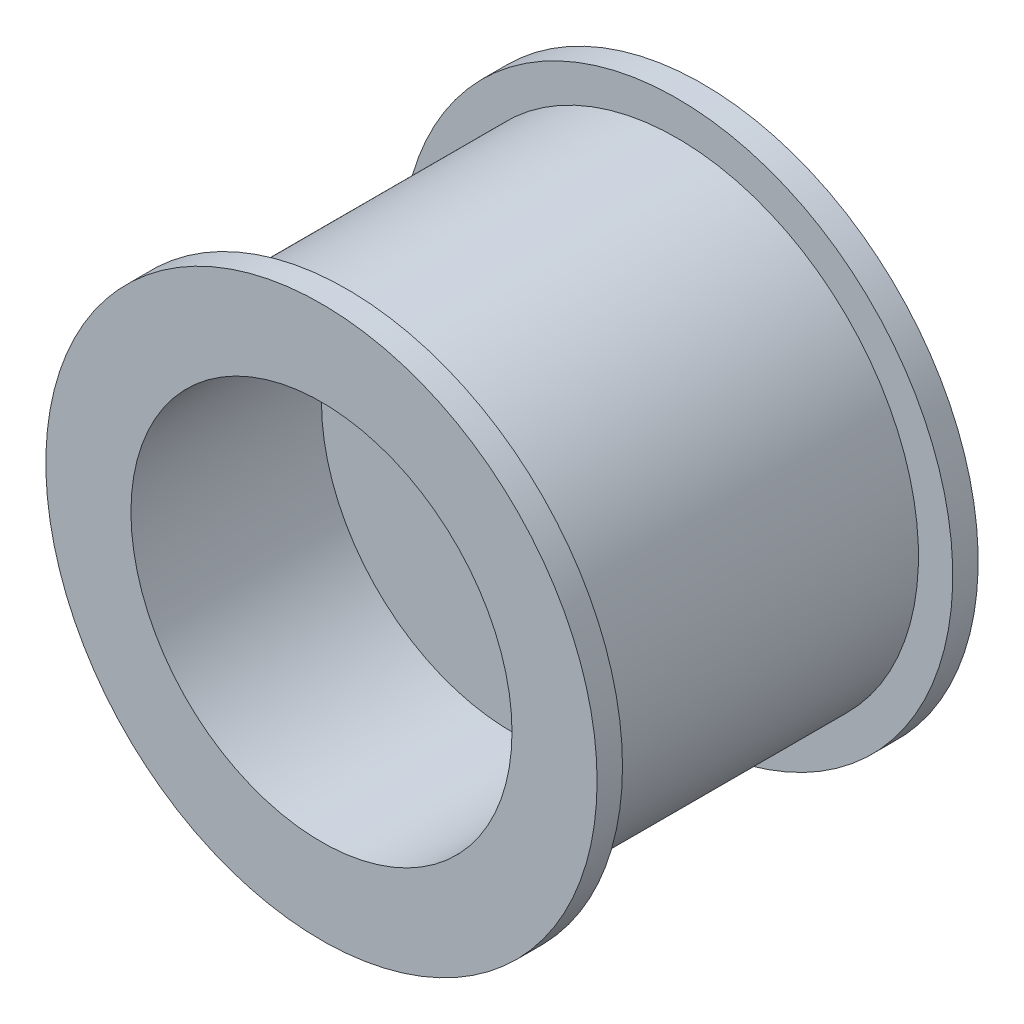
ISO-10303-21;
HEADER;
FILE_DESCRIPTION(('STEP AP214'),'2;1');
FILE_NAME('part.step','',(''),(''),'','','');
FILE_SCHEMA(('AUTOMOTIVE_DESIGN { 1 0 10303 214 1 1 1 1 }'));
ENDSEC;
DATA;
#1=APPLICATION_CONTEXT('core data for automotive mechanical design processes');
#2=APPLICATION_PROTOCOL_DEFINITION('international standard','automotive_design',2000,#1);
#3=PRODUCT_CONTEXT('',#1,'mechanical');
#4=PRODUCT('Part','Part','',(#3));
#5=PRODUCT_RELATED_PRODUCT_CATEGORY('part','',(#4));
#6=PRODUCT_DEFINITION_FORMATION('','',#4);
#7=PRODUCT_DEFINITION_CONTEXT('part definition',#1,'design');
#8=PRODUCT_DEFINITION('design','',#6,#7);
#9=PRODUCT_DEFINITION_SHAPE('','',#8);
#10=(LENGTH_UNIT() NAMED_UNIT(*) SI_UNIT(.MILLI.,.METRE.));
#11=(NAMED_UNIT(*) PLANE_ANGLE_UNIT() SI_UNIT($,.RADIAN.));
#12=(NAMED_UNIT(*) SI_UNIT($,.STERADIAN.) SOLID_ANGLE_UNIT());
#13=UNCERTAINTY_MEASURE_WITH_UNIT(LENGTH_MEASURE(1.E-05),#10,'distance_accuracy_value','');
#14=(GEOMETRIC_REPRESENTATION_CONTEXT(3) GLOBAL_UNCERTAINTY_ASSIGNED_CONTEXT((#13)) GLOBAL_UNIT_ASSIGNED_CONTEXT((#10,
#11,#12)) REPRESENTATION_CONTEXT('',''));
#15=CARTESIAN_POINT('',(0.,0.,0.));
#16=DIRECTION('',(0.,0.,1.));
#17=DIRECTION('',(1.,0.,0.));
#18=AXIS2_PLACEMENT_3D('',#15,#16,#17);
#19=CARTESIAN_POINT('',(0.,0.,26.));
#20=DIRECTION('',(0.,0.,-1.));
#21=DIRECTION('',(-1.,0.,0.));
#22=AXIS2_PLACEMENT_3D('',#19,#20,#21);
#23=CYLINDRICAL_SURFACE('',#22,19.);
#24=CARTESIAN_POINT('',(0.,0.,26.));
#25=DIRECTION('',(0.,0.,1.));
#26=DIRECTION('',(1.,0.,0.));
#27=AXIS2_PLACEMENT_3D('',#24,#25,#26);
#28=CIRCLE('',#27,19.);
#29=CARTESIAN_POINT('',(-19.,0.,26.));
#30=VERTEX_POINT('',#29);
#31=EDGE_CURVE('E10',#30,#30,#28,.T.);
#32=CARTESIAN_POINT('',(0.,0.,0.));
#33=DIRECTION('',(0.,0.,1.));
#34=DIRECTION('',(1.,0.,0.));
#35=AXIS2_PLACEMENT_3D('',#32,#33,#34);
#36=CIRCLE('',#35,19.);
#37=CARTESIAN_POINT('',(-19.,0.,0.));
#38=VERTEX_POINT('',#37);
#39=EDGE_CURVE('E37',#38,#38,#36,.T.);
#40=CARTESIAN_POINT('',(-19.,0.,26.));
#41=CARTESIAN_POINT('',(-19.,0.,25.7291666666667));
#42=CARTESIAN_POINT('',(-19.,0.,25.4583333333333));
#43=CARTESIAN_POINT('',(-19.,0.,24.9166666666667));
#44=CARTESIAN_POINT('',(-19.,0.,24.6458333333333));
#45=CARTESIAN_POINT('',(-19.,0.,24.1041666666667));
#46=CARTESIAN_POINT('',(-19.,0.,23.8333333333333));
#47=CARTESIAN_POINT('',(-19.,0.,23.2916666666667));
#48=CARTESIAN_POINT('',(-19.,0.,23.0208333333333));
#49=CARTESIAN_POINT('',(-19.,0.,22.4791666666667));
#50=CARTESIAN_POINT('',(-19.,0.,22.2083333333333));
#51=CARTESIAN_POINT('',(-19.,0.,21.6666666666667));
#52=CARTESIAN_POINT('',(-19.,0.,21.3958333333333));
#53=CARTESIAN_POINT('',(-19.,0.,20.8541666666667));
#54=CARTESIAN_POINT('',(-19.,0.,20.5833333333333));
#55=CARTESIAN_POINT('',(-19.,0.,20.0416666666667));
#56=CARTESIAN_POINT('',(-19.,0.,19.7708333333333));
#57=CARTESIAN_POINT('',(-19.,0.,19.2291666666667));
#58=CARTESIAN_POINT('',(-19.,0.,18.9583333333333));
#59=CARTESIAN_POINT('',(-19.,0.,18.4166666666667));
#60=CARTESIAN_POINT('',(-19.,0.,18.1458333333333));
#61=CARTESIAN_POINT('',(-19.,0.,17.6041666666667));
#62=CARTESIAN_POINT('',(-19.,0.,17.3333333333333));
#63=CARTESIAN_POINT('',(-19.,0.,16.7916666666667));
#64=CARTESIAN_POINT('',(-19.,0.,16.5208333333333));
#65=CARTESIAN_POINT('',(-19.,0.,15.9791666666667));
#66=CARTESIAN_POINT('',(-19.,0.,15.7083333333333));
#67=CARTESIAN_POINT('',(-19.,0.,15.1666666666667));
#68=CARTESIAN_POINT('',(-19.,0.,14.8958333333333));
#69=CARTESIAN_POINT('',(-19.,0.,14.3541666666667));
#70=CARTESIAN_POINT('',(-19.,0.,14.0833333333333));
#71=CARTESIAN_POINT('',(-19.,0.,13.5416666666667));
#72=CARTESIAN_POINT('',(-19.,0.,13.2708333333333));
#73=CARTESIAN_POINT('',(-19.,0.,12.7291666666667));
#74=CARTESIAN_POINT('',(-19.,0.,12.4583333333333));
#75=CARTESIAN_POINT('',(-19.,0.,11.9166666666667));
#76=CARTESIAN_POINT('',(-19.,0.,11.6458333333333));
#77=CARTESIAN_POINT('',(-19.,0.,11.1041666666667));
#78=CARTESIAN_POINT('',(-19.,0.,10.8333333333333));
#79=CARTESIAN_POINT('',(-19.,0.,10.2916666666667));
#80=CARTESIAN_POINT('',(-19.,0.,10.0208333333333));
#81=CARTESIAN_POINT('',(-19.,0.,9.47916666666667));
#82=CARTESIAN_POINT('',(-19.,0.,9.20833333333333));
#83=CARTESIAN_POINT('',(-19.,0.,8.66666666666667));
#84=CARTESIAN_POINT('',(-19.,0.,8.39583333333333));
#85=CARTESIAN_POINT('',(-19.,0.,7.85416666666667));
#86=CARTESIAN_POINT('',(-19.,0.,7.58333333333333));
#87=CARTESIAN_POINT('',(-19.,0.,7.04166666666667));
#88=CARTESIAN_POINT('',(-19.,0.,6.77083333333333));
#89=CARTESIAN_POINT('',(-19.,0.,6.22916666666667));
#90=CARTESIAN_POINT('',(-19.,0.,5.95833333333333));
#91=CARTESIAN_POINT('',(-19.,0.,5.41666666666667));
#92=CARTESIAN_POINT('',(-19.,0.,5.14583333333333));
#93=CARTESIAN_POINT('',(-19.,0.,4.60416666666667));
#94=CARTESIAN_POINT('',(-19.,0.,4.33333333333333));
#95=CARTESIAN_POINT('',(-19.,0.,3.79166666666667));
#96=CARTESIAN_POINT('',(-19.,0.,3.52083333333333));
#97=CARTESIAN_POINT('',(-19.,0.,2.97916666666667));
#98=CARTESIAN_POINT('',(-19.,0.,2.70833333333333));
#99=CARTESIAN_POINT('',(-19.,0.,2.16666666666667));
#100=CARTESIAN_POINT('',(-19.,0.,1.89583333333333));
#101=CARTESIAN_POINT('',(-19.,0.,1.35416666666667));
#102=CARTESIAN_POINT('',(-19.,0.,1.08333333333333));
#103=CARTESIAN_POINT('',(-19.,0.,0.541666666666667));
#104=CARTESIAN_POINT('',(-19.,0.,0.270833333333334));
#105=CARTESIAN_POINT('',(-19.,0.,0.));
#106=B_SPLINE_CURVE_WITH_KNOTS('',3,(#40,#41,#42,#43,#44,#45,#46,#47,#48,#49,#50,#51,#52,#53,
#54,#55,#56,#57,#58,#59,#60,#61,#62,#63,#64,#65,#66,#67,#68,#69,#70,#71,#72,#73,#74,#75,#76,#77,
#78,#79,#80,#81,#82,#83,#84,#85,#86,#87,#88,#89,#90,#91,#92,#93,#94,#95,#96,#97,#98,#99,#100,
#101,#102,#103,#104,#105),.UNSPECIFIED.,.F.,.F.,(4,2,2,2,2,2,2,2,2,2,2,2,2,2,2,2,2,2,2,2,2,2,2,
2,2,2,2,2,2,2,2,2,4),(0.,0.812500000000001,1.625,2.4375,3.25,4.0625,4.875,5.6875,6.5,7.3125,
8.125,8.9375,9.75,10.5625,11.375,12.1875,13.,13.8125,14.625,15.4375,16.25,17.0625,17.875,
18.6875,19.5,20.3125,21.125,21.9375,22.75,23.5625,24.375,25.1875,26.),.UNSPECIFIED.);
#107=EDGE_CURVE('BSEAM34',#30,#38,#106,.T.);
#108=ORIENTED_EDGE('',*,*,#31,.F.);
#109=ORIENTED_EDGE('',*,*,#39,.T.);
#110=ORIENTED_EDGE('',*,*,#107,.T.);
#111=ORIENTED_EDGE('',*,*,#107,.F.);
#112=EDGE_LOOP('',(#108,#110,#109,#111));
#113=FACE_BOUND('',#112,.T.);
#114=ADVANCED_FACE('F34',(#113),#23,.T.);
#115=CARTESIAN_POINT('',(0.,0.,28.));
#116=DIRECTION('',(0.,0.,-1.));
#117=DIRECTION('',(-1.,0.,0.));
#118=AXIS2_PLACEMENT_3D('',#115,#116,#117);
#119=CYLINDRICAL_SURFACE('',#118,21.7);
#120=CARTESIAN_POINT('',(0.,0.,28.));
#121=DIRECTION('',(0.,0.,1.));
#122=DIRECTION('',(1.,0.,0.));
#123=AXIS2_PLACEMENT_3D('',#120,#121,#122);
#124=CIRCLE('',#123,21.7);
#125=CARTESIAN_POINT('',(21.7,0.,28.));
#126=VERTEX_POINT('',#125);
#127=EDGE_CURVE('E41',#126,#126,#124,.T.);
#128=ORIENTED_EDGE('',*,*,#127,.F.);
#129=EDGE_LOOP('',(#128));
#130=FACE_BOUND('',#129,.T.);
#131=CARTESIAN_POINT('',(0.,0.,26.));
#132=DIRECTION('',(0.,0.,1.));
#133=DIRECTION('',(1.,0.,0.));
#134=AXIS2_PLACEMENT_3D('',#131,#132,#133);
#135=CIRCLE('',#134,21.7);
#136=CARTESIAN_POINT('',(21.7,0.,26.));
#137=VERTEX_POINT('',#136);
#138=EDGE_CURVE('E45',#137,#137,#135,.T.);
#139=ORIENTED_EDGE('',*,*,#138,.T.);
#140=EDGE_LOOP('',(#139));
#141=FACE_BOUND('',#140,.T.);
#142=ADVANCED_FACE('F152',(#130,#141),#119,.T.);
#143=CARTESIAN_POINT('',(0.,0.,28.));
#144=DIRECTION('',(0.,0.,1.));
#145=DIRECTION('',(1.,0.,0.));
#146=AXIS2_PLACEMENT_3D('',#143,#144,#145);
#147=PLANE('',#146);
#148=CARTESIAN_POINT('',(0.,0.,28.));
#149=DIRECTION('',(0.,0.,1.));
#150=DIRECTION('',(1.,0.,0.));
#151=AXIS2_PLACEMENT_3D('',#148,#149,#150);
#152=CIRCLE('',#151,15.);
#153=CARTESIAN_POINT('',(15.,0.,28.));
#154=VERTEX_POINT('',#153);
#155=EDGE_CURVE('E57',#154,#154,#152,.T.);
#156=ORIENTED_EDGE('',*,*,#155,.F.);
#157=EDGE_LOOP('',(#156));
#158=FACE_BOUND('',#157,.T.);
#159=ORIENTED_EDGE('',*,*,#127,.T.);
#160=EDGE_LOOP('',(#159));
#161=FACE_BOUND('',#160,.T.);
#162=ADVANCED_FACE('F157',(#158,#161),#147,.T.);
#163=CARTESIAN_POINT('',(0.,0.,26.));
#164=DIRECTION('',(0.,0.,1.));
#165=DIRECTION('',(1.,0.,0.));
#166=AXIS2_PLACEMENT_3D('',#163,#164,#165);
#167=PLANE('',#166);
#168=ORIENTED_EDGE('',*,*,#31,.T.);
#169=EDGE_LOOP('',(#168));
#170=FACE_BOUND('',#169,.T.);
#171=ORIENTED_EDGE('',*,*,#138,.F.);
#172=EDGE_LOOP('',(#171));
#173=FACE_BOUND('',#172,.T.);
#174=ADVANCED_FACE('F136',(#170,#173),#167,.F.);
#175=CARTESIAN_POINT('',(0.,0.,-2.));
#176=DIRECTION('',(0.,0.,1.));
#177=DIRECTION('',(1.,0.,0.));
#178=AXIS2_PLACEMENT_3D('',#175,#176,#177);
#179=CYLINDRICAL_SURFACE('',#178,21.7);
#180=CARTESIAN_POINT('',(0.,0.,-2.));
#181=DIRECTION('',(0.,0.,-1.));
#182=DIRECTION('',(-1.,0.,0.));
#183=AXIS2_PLACEMENT_3D('',#180,#181,#182);
#184=CIRCLE('',#183,21.7);
#185=CARTESIAN_POINT('',(-21.7,0.,-2.));
#186=VERTEX_POINT('',#185);
#187=EDGE_CURVE('E53',#186,#186,#184,.T.);
#188=ORIENTED_EDGE('',*,*,#187,.F.);
#189=EDGE_LOOP('',(#188));
#190=FACE_BOUND('',#189,.T.);
#191=CARTESIAN_POINT('',(0.,0.,0.));
#192=DIRECTION('',(0.,0.,-1.));
#193=DIRECTION('',(-1.,0.,0.));
#194=AXIS2_PLACEMENT_3D('',#191,#192,#193);
#195=CIRCLE('',#194,21.7);
#196=CARTESIAN_POINT('',(-21.7,0.,0.));
#197=VERTEX_POINT('',#196);
#198=EDGE_CURVE('E50',#197,#197,#195,.T.);
#199=ORIENTED_EDGE('',*,*,#198,.T.);
#200=EDGE_LOOP('',(#199));
#201=FACE_BOUND('',#200,.T.);
#202=ADVANCED_FACE('F118',(#190,#201),#179,.T.);
#203=CARTESIAN_POINT('',(0.,0.,-2.));
#204=DIRECTION('',(0.,0.,-1.));
#205=DIRECTION('',(-1.,0.,0.));
#206=AXIS2_PLACEMENT_3D('',#203,#204,#205);
#207=PLANE('',#206);
#208=CARTESIAN_POINT('',(0.,12.5,-2.));
#209=DIRECTION('',(0.,0.,-1.));
#210=DIRECTION('',(-1.,0.,0.));
#211=AXIS2_PLACEMENT_3D('',#208,#209,#210);
#212=CIRCLE('',#211,3.);
#213=CARTESIAN_POINT('',(-3.,12.5,-2.));
#214=VERTEX_POINT('',#213);
#215=EDGE_CURVE('E94',#214,#214,#212,.T.);
#216=ORIENTED_EDGE('',*,*,#215,.F.);
#217=EDGE_LOOP('',(#216));
#218=FACE_BOUND('',#217,.T.);
#219=CARTESIAN_POINT('',(10.8253175473055,6.24999999999999,-2.));
#220=DIRECTION('',(0.,0.,-1.));
#221=DIRECTION('',(-1.,0.,0.));
#222=AXIS2_PLACEMENT_3D('',#219,#220,#221);
#223=CIRCLE('',#222,3.00000000000015);
#224=CARTESIAN_POINT('',(7.82531754730534,6.24999999999999,-2.));
#225=VERTEX_POINT('',#224);
#226=EDGE_CURVE('E73',#225,#225,#223,.T.);
#227=ORIENTED_EDGE('',*,*,#226,.F.);
#228=EDGE_LOOP('',(#227));
#229=FACE_BOUND('',#228,.T.);
#230=CARTESIAN_POINT('',(10.8253175473055,-6.25000000000001,-2.));
#231=DIRECTION('',(0.,0.,-1.));
#232=DIRECTION('',(-1.,0.,0.));
#233=AXIS2_PLACEMENT_3D('',#230,#231,#232);
#234=CIRCLE('',#233,3.00000000000012);
#235=CARTESIAN_POINT('',(7.82531754730536,-6.25000000000001,-2.));
#236=VERTEX_POINT('',#235);
#237=EDGE_CURVE('E72',#236,#236,#234,.T.);
#238=ORIENTED_EDGE('',*,*,#237,.F.);
#239=EDGE_LOOP('',(#238));
#240=FACE_BOUND('',#239,.T.);
#241=CARTESIAN_POINT('',(0.,-12.5,-2.));
#242=DIRECTION('',(0.,0.,-1.));
#243=DIRECTION('',(-1.,0.,0.));
#244=AXIS2_PLACEMENT_3D('',#241,#242,#243);
#245=CIRCLE('',#244,3.00000000000009);
#246=CARTESIAN_POINT('',(-3.00000000000009,-12.5,-2.));
#247=VERTEX_POINT('',#246);
#248=EDGE_CURVE('E79',#247,#247,#245,.T.);
#249=ORIENTED_EDGE('',*,*,#248,.F.);
#250=EDGE_LOOP('',(#249));
#251=FACE_BOUND('',#250,.T.);
#252=CARTESIAN_POINT('',(-10.8253175473055,-6.25,-2.));
#253=DIRECTION('',(0.,0.,-1.));
#254=DIRECTION('',(-1.,0.,0.));
#255=AXIS2_PLACEMENT_3D('',#252,#253,#254);
#256=CIRCLE('',#255,3.00000000000006);
#257=CARTESIAN_POINT('',(-13.8253175473055,-6.25,-2.));
#258=VERTEX_POINT('',#257);
#259=EDGE_CURVE('E85',#258,#258,#256,.T.);
#260=ORIENTED_EDGE('',*,*,#259,.F.);
#261=EDGE_LOOP('',(#260));
#262=FACE_BOUND('',#261,.T.);
#263=CARTESIAN_POINT('',(-10.8253175473055,6.25,-2.));
#264=DIRECTION('',(0.,0.,-1.));
#265=DIRECTION('',(-1.,0.,0.));
#266=AXIS2_PLACEMENT_3D('',#263,#264,#265);
#267=CIRCLE('',#266,3.00000000000003);
#268=CARTESIAN_POINT('',(-13.8253175473055,6.25,-2.));
#269=VERTEX_POINT('',#268);
#270=EDGE_CURVE('E91',#269,#269,#267,.T.);
#271=ORIENTED_EDGE('',*,*,#270,.F.);
#272=EDGE_LOOP('',(#271));
#273=FACE_BOUND('',#272,.T.);
#274=CARTESIAN_POINT('',(0.,0.,-2.));
#275=DIRECTION('',(0.,0.,1.));
#276=DIRECTION('',(1.,0.,0.));
#277=AXIS2_PLACEMENT_3D('',#274,#275,#276);
#278=CIRCLE('',#277,3.);
#279=CARTESIAN_POINT('',(3.,0.,-2.));
#280=VERTEX_POINT('',#279);
#281=EDGE_CURVE('E60',#280,#280,#278,.T.);
#282=ORIENTED_EDGE('',*,*,#281,.T.);
#283=EDGE_LOOP('',(#282));
#284=FACE_BOUND('',#283,.T.);
#285=ORIENTED_EDGE('',*,*,#187,.T.);
#286=EDGE_LOOP('',(#285));
#287=FACE_BOUND('',#286,.T.);
#288=ADVANCED_FACE('F114',(#218,#229,#240,#251,#262,#273,#284,#287),#207,.T.);
#289=CARTESIAN_POINT('',(0.,0.,0.));
#290=DIRECTION('',(0.,0.,-1.));
#291=DIRECTION('',(-1.,0.,0.));
#292=AXIS2_PLACEMENT_3D('',#289,#290,#291);
#293=PLANE('',#292);
#294=ORIENTED_EDGE('',*,*,#39,.F.);
#295=EDGE_LOOP('',(#294));
#296=FACE_BOUND('',#295,.T.);
#297=ORIENTED_EDGE('',*,*,#198,.F.);
#298=EDGE_LOOP('',(#297));
#299=FACE_BOUND('',#298,.T.);
#300=ADVANCED_FACE('F117',(#296,#299),#293,.F.);
#301=CARTESIAN_POINT('',(0.,0.,13.));
#302=DIRECTION('',(0.,0.,1.));
#303=DIRECTION('',(1.,0.,0.));
#304=AXIS2_PLACEMENT_3D('',#301,#302,#303);
#305=CYLINDRICAL_SURFACE('',#304,15.);
#306=CARTESIAN_POINT('',(0.,0.,13.));
#307=DIRECTION('',(0.,0.,1.));
#308=DIRECTION('',(1.,0.,0.));
#309=AXIS2_PLACEMENT_3D('',#306,#307,#308);
#310=CIRCLE('',#309,15.);
#311=CARTESIAN_POINT('',(15.,0.,13.));
#312=VERTEX_POINT('',#311);
#313=EDGE_CURVE('E54',#312,#312,#310,.T.);
#314=ORIENTED_EDGE('',*,*,#313,.F.);
#315=EDGE_LOOP('',(#314));
#316=FACE_BOUND('',#315,.T.);
#317=ORIENTED_EDGE('',*,*,#155,.T.);
#318=EDGE_LOOP('',(#317));
#319=FACE_BOUND('',#318,.T.);
#320=ADVANCED_FACE('F141',(#316,#319),#305,.F.);
#321=CARTESIAN_POINT('',(0.,0.,13.));
#322=DIRECTION('',(0.,0.,1.));
#323=DIRECTION('',(1.,0.,0.));
#324=AXIS2_PLACEMENT_3D('',#321,#322,#323);
#325=PLANE('',#324);
#326=CARTESIAN_POINT('',(0.,0.,13.));
#327=DIRECTION('',(0.,0.,1.));
#328=DIRECTION('',(1.,0.,0.));
#329=AXIS2_PLACEMENT_3D('',#326,#327,#328);
#330=CIRCLE('',#329,3.);
#331=CARTESIAN_POINT('',(3.,0.,13.));
#332=VERTEX_POINT('',#331);
#333=EDGE_CURVE('E63',#332,#332,#330,.T.);
#334=ORIENTED_EDGE('',*,*,#333,.F.);
#335=EDGE_LOOP('',(#334));
#336=FACE_BOUND('',#335,.T.);
#337=ORIENTED_EDGE('',*,*,#313,.T.);
#338=EDGE_LOOP('',(#337));
#339=FACE_BOUND('',#338,.T.);
#340=ADVANCED_FACE('F147',(#336,#339),#325,.T.);
#341=CARTESIAN_POINT('',(0.,0.,-2.));
#342=DIRECTION('',(0.,0.,1.));
#343=DIRECTION('',(1.,0.,0.));
#344=AXIS2_PLACEMENT_3D('',#341,#342,#343);
#345=CYLINDRICAL_SURFACE('',#344,3.);
#346=CARTESIAN_POINT('',(3.,0.,-2.));
#347=CARTESIAN_POINT('',(3.,0.,-1.84375));
#348=CARTESIAN_POINT('',(3.,0.,-1.6875));
#349=CARTESIAN_POINT('',(3.,0.,-1.375));
#350=CARTESIAN_POINT('',(3.,0.,-1.21875));
#351=CARTESIAN_POINT('',(3.,0.,-0.90625));
#352=CARTESIAN_POINT('',(3.,0.,-0.75));
#353=CARTESIAN_POINT('',(3.,0.,-0.437500000000001));
#354=CARTESIAN_POINT('',(3.,0.,-0.281250000000001));
#355=CARTESIAN_POINT('',(3.,0.,0.0312499999999995));
#356=CARTESIAN_POINT('',(3.,0.,0.187499999999999));
#357=CARTESIAN_POINT('',(3.,0.,0.499999999999999));
#358=CARTESIAN_POINT('',(3.,0.,0.656249999999999));
#359=CARTESIAN_POINT('',(3.,0.,0.968749999999999));
#360=CARTESIAN_POINT('',(3.,0.,1.125));
#361=CARTESIAN_POINT('',(3.,0.,1.4375));
#362=CARTESIAN_POINT('',(3.,0.,1.59375));
#363=CARTESIAN_POINT('',(3.,0.,1.90625));
#364=CARTESIAN_POINT('',(3.,0.,2.0625));
#365=CARTESIAN_POINT('',(3.,0.,2.375));
#366=CARTESIAN_POINT('',(3.,0.,2.53125));
#367=CARTESIAN_POINT('',(3.,0.,2.84375));
#368=CARTESIAN_POINT('',(3.,0.,3.));
#369=CARTESIAN_POINT('',(3.,0.,3.3125));
#370=CARTESIAN_POINT('',(3.,0.,3.46875));
#371=CARTESIAN_POINT('',(3.,0.,3.78125));
#372=CARTESIAN_POINT('',(3.,0.,3.9375));
#373=CARTESIAN_POINT('',(3.,0.,4.25));
#374=CARTESIAN_POINT('',(3.,0.,4.40625));
#375=CARTESIAN_POINT('',(3.,0.,4.71875));
#376=CARTESIAN_POINT('',(3.,0.,4.875));
#377=CARTESIAN_POINT('',(3.,0.,5.1875));
#378=CARTESIAN_POINT('',(3.,0.,5.34375));
#379=CARTESIAN_POINT('',(3.,0.,5.65625));
#380=CARTESIAN_POINT('',(3.,0.,5.8125));
#381=CARTESIAN_POINT('',(3.,0.,6.125));
#382=CARTESIAN_POINT('',(3.,0.,6.28125));
#383=CARTESIAN_POINT('',(3.,0.,6.59375));
#384=CARTESIAN_POINT('',(3.,0.,6.75));
#385=CARTESIAN_POINT('',(3.,0.,7.0625));
#386=CARTESIAN_POINT('',(3.,0.,7.21875));
#387=CARTESIAN_POINT('',(3.,0.,7.53125));
#388=CARTESIAN_POINT('',(3.,0.,7.6875));
#389=CARTESIAN_POINT('',(3.,0.,8.));
#390=CARTESIAN_POINT('',(3.,0.,8.15625));
#391=CARTESIAN_POINT('',(3.,0.,8.46875));
#392=CARTESIAN_POINT('',(3.,0.,8.625));
#393=CARTESIAN_POINT('',(3.,0.,8.9375));
#394=CARTESIAN_POINT('',(3.,0.,9.09375));
#395=CARTESIAN_POINT('',(3.,0.,9.40625));
#396=CARTESIAN_POINT('',(3.,0.,9.5625));
#397=CARTESIAN_POINT('',(3.,0.,9.875));
#398=CARTESIAN_POINT('',(3.,0.,10.03125));
#399=CARTESIAN_POINT('',(3.,0.,10.34375));
#400=CARTESIAN_POINT('',(3.,0.,10.5));
#401=CARTESIAN_POINT('',(3.,0.,10.8125));
#402=CARTESIAN_POINT('',(3.,0.,10.96875));
#403=CARTESIAN_POINT('',(3.,0.,11.28125));
#404=CARTESIAN_POINT('',(3.,0.,11.4375));
#405=CARTESIAN_POINT('',(3.,0.,11.75));
#406=CARTESIAN_POINT('',(3.,0.,11.90625));
#407=CARTESIAN_POINT('',(3.,0.,12.21875));
#408=CARTESIAN_POINT('',(3.,0.,12.375));
#409=CARTESIAN_POINT('',(3.,0.,12.6875));
#410=CARTESIAN_POINT('',(3.,0.,12.84375));
#411=CARTESIAN_POINT('',(3.,0.,13.));
#412=B_SPLINE_CURVE_WITH_KNOTS('',3,(#346,#347,#348,#349,#350,#351,#352,#353,#354,#355,#356,
#357,#358,#359,#360,#361,#362,#363,#364,#365,#366,#367,#368,#369,#370,#371,#372,#373,#374,#375,
#376,#377,#378,#379,#380,#381,#382,#383,#384,#385,#386,#387,#388,#389,#390,#391,#392,#393,#394,
#395,#396,#397,#398,#399,#400,#401,#402,#403,#404,#405,#406,#407,#408,#409,#410,#411),
.UNSPECIFIED.,.F.,.F.,(4,2,2,2,2,2,2,2,2,2,2,2,2,2,2,2,2,2,2,2,2,2,2,2,2,2,2,2,2,2,2,2,4),(0.,
0.46875,0.9375,1.40625,1.875,2.34375,2.8125,3.28125,3.75,4.21875,4.6875,5.15625,5.625,6.09375,
6.5625,7.03125,7.5,7.96875,8.4375,8.90625,9.375,9.84375,10.3125,10.78125,11.25,11.71875,12.1875,
12.65625,13.125,13.59375,14.0625,14.53125,15.),.UNSPECIFIED.);
#413=EDGE_CURVE('BSEAM191',#280,#332,#412,.T.);
#414=ORIENTED_EDGE('',*,*,#281,.F.);
#415=ORIENTED_EDGE('',*,*,#333,.T.);
#416=ORIENTED_EDGE('',*,*,#413,.T.);
#417=ORIENTED_EDGE('',*,*,#413,.F.);
#418=EDGE_LOOP('',(#414,#416,#415,#417));
#419=FACE_BOUND('',#418,.T.);
#420=ADVANCED_FACE('F191',(#419),#345,.F.);
#421=CARTESIAN_POINT('',(-10.8253175473055,6.25,8.));
#422=DIRECTION('',(0.,0.,-1.));
#423=DIRECTION('',(-1.,0.,0.));
#424=AXIS2_PLACEMENT_3D('',#421,#422,#423);
#425=CYLINDRICAL_SURFACE('',#424,3.00000000000003);
#426=CARTESIAN_POINT('',(-10.8253175473055,6.25,8.));
#427=DIRECTION('',(0.,0.,-1.));
#428=DIRECTION('',(-1.,0.,0.));
#429=AXIS2_PLACEMENT_3D('',#426,#427,#428);
#430=CIRCLE('',#429,3.00000000000003);
#431=CARTESIAN_POINT('',(-13.8253175473055,6.25,8.));
#432=VERTEX_POINT('',#431);
#433=EDGE_CURVE('E88',#432,#432,#430,.T.);
#434=ORIENTED_EDGE('',*,*,#433,.F.);
#435=EDGE_LOOP('',(#434));
#436=FACE_BOUND('',#435,.T.);
#437=ORIENTED_EDGE('',*,*,#270,.T.);
#438=EDGE_LOOP('',(#437));
#439=FACE_BOUND('',#438,.T.);
#440=ADVANCED_FACE('F196',(#436,#439),#425,.F.);
#441=CARTESIAN_POINT('',(-10.8253175473055,6.25,8.));
#442=DIRECTION('',(0.,0.,-1.));
#443=DIRECTION('',(-1.,0.,0.));
#444=AXIS2_PLACEMENT_3D('',#441,#442,#443);
#445=PLANE('',#444);
#446=ORIENTED_EDGE('',*,*,#433,.T.);
#447=EDGE_LOOP('',(#446));
#448=FACE_BOUND('',#447,.T.);
#449=ADVANCED_FACE('F201',(#448),#445,.T.);
#450=CARTESIAN_POINT('',(-10.8253175473055,-6.25,8.));
#451=DIRECTION('',(0.,0.,-1.));
#452=DIRECTION('',(-1.,0.,0.));
#453=AXIS2_PLACEMENT_3D('',#450,#451,#452);
#454=CYLINDRICAL_SURFACE('',#453,3.00000000000006);
#455=CARTESIAN_POINT('',(-10.8253175473055,-6.25,8.));
#456=DIRECTION('',(0.,0.,-1.));
#457=DIRECTION('',(-1.,0.,0.));
#458=AXIS2_PLACEMENT_3D('',#455,#456,#457);
#459=CIRCLE('',#458,3.00000000000006);
#460=CARTESIAN_POINT('',(-13.8253175473055,-6.25,8.));
#461=VERTEX_POINT('',#460);
#462=EDGE_CURVE('E82',#461,#461,#459,.T.);
#463=ORIENTED_EDGE('',*,*,#462,.F.);
#464=EDGE_LOOP('',(#463));
#465=FACE_BOUND('',#464,.T.);
#466=ORIENTED_EDGE('',*,*,#259,.T.);
#467=EDGE_LOOP('',(#466));
#468=FACE_BOUND('',#467,.T.);
#469=ADVANCED_FACE('F211',(#465,#468),#454,.F.);
#470=CARTESIAN_POINT('',(-10.8253175473055,-6.25,8.));
#471=DIRECTION('',(0.,0.,-1.));
#472=DIRECTION('',(-1.,0.,0.));
#473=AXIS2_PLACEMENT_3D('',#470,#471,#472);
#474=PLANE('',#473);
#475=ORIENTED_EDGE('',*,*,#462,.T.);
#476=EDGE_LOOP('',(#475));
#477=FACE_BOUND('',#476,.T.);
#478=ADVANCED_FACE('F221',(#477),#474,.T.);
#479=CARTESIAN_POINT('',(0.,-12.5,8.));
#480=DIRECTION('',(0.,0.,-1.));
#481=DIRECTION('',(-1.,0.,0.));
#482=AXIS2_PLACEMENT_3D('',#479,#480,#481);
#483=CYLINDRICAL_SURFACE('',#482,3.00000000000009);
#484=CARTESIAN_POINT('',(0.,-12.5,8.));
#485=DIRECTION('',(0.,0.,-1.));
#486=DIRECTION('',(-1.,0.,0.));
#487=AXIS2_PLACEMENT_3D('',#484,#485,#486);
#488=CIRCLE('',#487,3.00000000000009);
#489=CARTESIAN_POINT('',(-3.00000000000009,-12.5,8.));
#490=VERTEX_POINT('',#489);
#491=EDGE_CURVE('E76',#490,#490,#488,.T.);
#492=ORIENTED_EDGE('',*,*,#491,.F.);
#493=EDGE_LOOP('',(#492));
#494=FACE_BOUND('',#493,.T.);
#495=ORIENTED_EDGE('',*,*,#248,.T.);
#496=EDGE_LOOP('',(#495));
#497=FACE_BOUND('',#496,.T.);
#498=ADVANCED_FACE('F231',(#494,#497),#483,.F.);
#499=CARTESIAN_POINT('',(0.,-12.5,8.));
#500=DIRECTION('',(0.,0.,-1.));
#501=DIRECTION('',(-1.,0.,0.));
#502=AXIS2_PLACEMENT_3D('',#499,#500,#501);
#503=PLANE('',#502);
#504=ORIENTED_EDGE('',*,*,#491,.T.);
#505=EDGE_LOOP('',(#504));
#506=FACE_BOUND('',#505,.T.);
#507=ADVANCED_FACE('F241',(#506),#503,.T.);
#508=CARTESIAN_POINT('',(10.8253175473055,-6.25000000000001,8.));
#509=DIRECTION('',(0.,0.,-1.));
#510=DIRECTION('',(-1.,0.,0.));
#511=AXIS2_PLACEMENT_3D('',#508,#509,#510);
#512=CYLINDRICAL_SURFACE('',#511,3.00000000000012);
#513=CARTESIAN_POINT('',(10.8253175473055,-6.25000000000001,8.));
#514=DIRECTION('',(0.,0.,-1.));
#515=DIRECTION('',(-1.,0.,0.));
#516=AXIS2_PLACEMENT_3D('',#513,#514,#515);
#517=CIRCLE('',#516,3.00000000000012);
#518=CARTESIAN_POINT('',(7.82531754730536,-6.25000000000001,8.));
#519=VERTEX_POINT('',#518);
#520=EDGE_CURVE('E69',#519,#519,#517,.T.);
#521=ORIENTED_EDGE('',*,*,#520,.F.);
#522=EDGE_LOOP('',(#521));
#523=FACE_BOUND('',#522,.T.);
#524=ORIENTED_EDGE('',*,*,#237,.T.);
#525=EDGE_LOOP('',(#524));
#526=FACE_BOUND('',#525,.T.);
#527=ADVANCED_FACE('F251',(#523,#526),#512,.F.);
#528=CARTESIAN_POINT('',(10.8253175473055,-6.25000000000001,8.));
#529=DIRECTION('',(0.,0.,-1.));
#530=DIRECTION('',(-1.,0.,0.));
#531=AXIS2_PLACEMENT_3D('',#528,#529,#530);
#532=PLANE('',#531);
#533=ORIENTED_EDGE('',*,*,#520,.T.);
#534=EDGE_LOOP('',(#533));
#535=FACE_BOUND('',#534,.T.);
#536=ADVANCED_FACE('F261',(#535),#532,.T.);
#537=CARTESIAN_POINT('',(10.8253175473055,6.24999999999999,8.));
#538=DIRECTION('',(0.,0.,-1.));
#539=DIRECTION('',(-1.,0.,0.));
#540=AXIS2_PLACEMENT_3D('',#537,#538,#539);
#541=CYLINDRICAL_SURFACE('',#540,3.00000000000015);
#542=CARTESIAN_POINT('',(10.8253175473055,6.24999999999999,8.));
#543=DIRECTION('',(0.,0.,-1.));
#544=DIRECTION('',(-1.,0.,0.));
#545=AXIS2_PLACEMENT_3D('',#542,#543,#544);
#546=CIRCLE('',#545,3.00000000000015);
#547=CARTESIAN_POINT('',(7.82531754730534,6.24999999999999,8.));
#548=VERTEX_POINT('',#547);
#549=EDGE_CURVE('E95',#548,#548,#546,.T.);
#550=ORIENTED_EDGE('',*,*,#549,.F.);
#551=EDGE_LOOP('',(#550));
#552=FACE_BOUND('',#551,.T.);
#553=ORIENTED_EDGE('',*,*,#226,.T.);
#554=EDGE_LOOP('',(#553));
#555=FACE_BOUND('',#554,.T.);
#556=ADVANCED_FACE('F271',(#552,#555),#541,.F.);
#557=CARTESIAN_POINT('',(10.8253175473055,6.24999999999999,8.));
#558=DIRECTION('',(0.,0.,-1.));
#559=DIRECTION('',(-1.,0.,0.));
#560=AXIS2_PLACEMENT_3D('',#557,#558,#559);
#561=PLANE('',#560);
#562=ORIENTED_EDGE('',*,*,#549,.T.);
#563=EDGE_LOOP('',(#562));
#564=FACE_BOUND('',#563,.T.);
#565=ADVANCED_FACE('F110',(#564),#561,.T.);
#566=CARTESIAN_POINT('',(0.,12.5,8.));
#567=DIRECTION('',(0.,0.,-1.));
#568=DIRECTION('',(-1.,0.,0.));
#569=AXIS2_PLACEMENT_3D('',#566,#567,#568);
#570=CYLINDRICAL_SURFACE('',#569,3.);
#571=CARTESIAN_POINT('',(0.,12.5,8.));
#572=DIRECTION('',(0.,0.,-1.));
#573=DIRECTION('',(-1.,0.,0.));
#574=AXIS2_PLACEMENT_3D('',#571,#572,#573);
#575=CIRCLE('',#574,3.);
#576=CARTESIAN_POINT('',(-3.,12.5,8.));
#577=VERTEX_POINT('',#576);
#578=EDGE_CURVE('E66',#577,#577,#575,.T.);
#579=ORIENTED_EDGE('',*,*,#578,.F.);
#580=EDGE_LOOP('',(#579));
#581=FACE_BOUND('',#580,.T.);
#582=ORIENTED_EDGE('',*,*,#215,.T.);
#583=EDGE_LOOP('',(#582));
#584=FACE_BOUND('',#583,.T.);
#585=ADVANCED_FACE('F107',(#581,#584),#570,.F.);
#586=CARTESIAN_POINT('',(0.,12.5,8.));
#587=DIRECTION('',(0.,0.,-1.));
#588=DIRECTION('',(-1.,0.,0.));
#589=AXIS2_PLACEMENT_3D('',#586,#587,#588);
#590=PLANE('',#589);
#591=ORIENTED_EDGE('',*,*,#578,.T.);
#592=EDGE_LOOP('',(#591));
#593=FACE_BOUND('',#592,.T.);
#594=ADVANCED_FACE('F105',(#593),#590,.T.);
#595=CLOSED_SHELL('',(#114,#142,#162,#174,#202,#288,#300,#320,#340,#420,#440,#449,#469,#478,
#498,#507,#527,#536,#556,#565,#585,#594));
#596=MANIFOLD_SOLID_BREP('B2',#595);
#597=ADVANCED_BREP_SHAPE_REPRESENTATION('',(#18,#596),#14);
#598=SHAPE_DEFINITION_REPRESENTATION(#9,#597);
ENDSEC;
END-ISO-10303-21;
